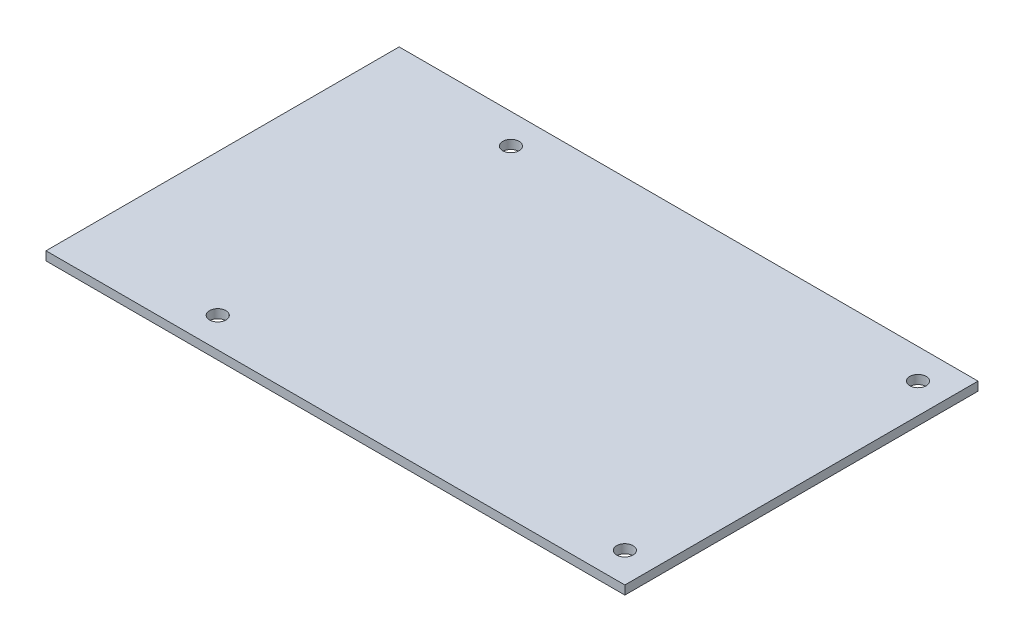
ISO-10303-21;
HEADER;
FILE_DESCRIPTION(('STEP AP214'),'2;1');
FILE_NAME('part.step','',(''),(''),'','','');
FILE_SCHEMA(('AUTOMOTIVE_DESIGN { 1 0 10303 214 1 1 1 1 }'));
ENDSEC;
DATA;
#1=APPLICATION_CONTEXT('core data for automotive mechanical design processes');
#2=APPLICATION_PROTOCOL_DEFINITION('international standard','automotive_design',2000,#1);
#3=PRODUCT_CONTEXT('',#1,'mechanical');
#4=PRODUCT('Part','Part','',(#3));
#5=PRODUCT_RELATED_PRODUCT_CATEGORY('part','',(#4));
#6=PRODUCT_DEFINITION_FORMATION('','',#4);
#7=PRODUCT_DEFINITION_CONTEXT('part definition',#1,'design');
#8=PRODUCT_DEFINITION('design','',#6,#7);
#9=PRODUCT_DEFINITION_SHAPE('','',#8);
#10=(LENGTH_UNIT() NAMED_UNIT(*) SI_UNIT(.MILLI.,.METRE.));
#11=(NAMED_UNIT(*) PLANE_ANGLE_UNIT() SI_UNIT($,.RADIAN.));
#12=(NAMED_UNIT(*) SI_UNIT($,.STERADIAN.) SOLID_ANGLE_UNIT());
#13=UNCERTAINTY_MEASURE_WITH_UNIT(LENGTH_MEASURE(1.E-05),#10,'distance_accuracy_value','');
#14=(GEOMETRIC_REPRESENTATION_CONTEXT(3) GLOBAL_UNCERTAINTY_ASSIGNED_CONTEXT((#13)) GLOBAL_UNIT_ASSIGNED_CONTEXT((#10,
#11,#12)) REPRESENTATION_CONTEXT('',''));
#15=CARTESIAN_POINT('',(0.,0.,0.));
#16=DIRECTION('',(0.,0.,1.));
#17=DIRECTION('',(1.,0.,0.));
#18=AXIS2_PLACEMENT_3D('',#15,#16,#17);
#19=CARTESIAN_POINT('',(53.086,1.6129,32.385));
#20=DIRECTION('',(-1.,0.,0.));
#21=DIRECTION('',(0.,0.,1.));
#22=AXIS2_PLACEMENT_3D('',#19,#20,#21);
#23=PLANE('',#22);
#24=DIRECTION('',(0.,0.,-1.));
#25=VECTOR('',#24,1.);
#26=CARTESIAN_POINT('',(53.086,0.,32.385));
#27=LINE('',#26,#25);
#28=CARTESIAN_POINT('',(53.086,0.,32.385));
#29=VERTEX_POINT('',#28);
#30=CARTESIAN_POINT('',(53.086,0.,-32.385));
#31=VERTEX_POINT('',#30);
#32=EDGE_CURVE('E113',#29,#31,#27,.T.);
#33=ORIENTED_EDGE('',*,*,#32,.T.);
#34=DIRECTION('',(0.,-1.,0.));
#35=VECTOR('',#34,1.);
#36=CARTESIAN_POINT('',(53.086,1.6129,-32.385));
#37=LINE('',#36,#35);
#38=CARTESIAN_POINT('',(53.086,1.6129,-32.385));
#39=VERTEX_POINT('',#38);
#40=EDGE_CURVE('E11',#39,#31,#37,.T.);
#41=ORIENTED_EDGE('',*,*,#40,.F.);
#42=DIRECTION('',(0.,0.,-1.));
#43=VECTOR('',#42,1.);
#44=CARTESIAN_POINT('',(53.086,1.6129,32.385));
#45=LINE('',#44,#43);
#46=CARTESIAN_POINT('',(53.086,1.6129,32.385));
#47=VERTEX_POINT('',#46);
#48=EDGE_CURVE('E97',#47,#39,#45,.T.);
#49=ORIENTED_EDGE('',*,*,#48,.F.);
#50=DIRECTION('',(0.,-1.,0.));
#51=VECTOR('',#50,1.);
#52=CARTESIAN_POINT('',(53.086,1.6129,32.385));
#53=LINE('',#52,#51);
#54=EDGE_CURVE('E109',#47,#29,#53,.T.);
#55=ORIENTED_EDGE('',*,*,#54,.T.);
#56=EDGE_LOOP('',(#33,#41,#49,#55));
#57=FACE_BOUND('',#56,.T.);
#58=ADVANCED_FACE('F45',(#57),#23,.F.);
#59=CARTESIAN_POINT('',(-53.086,1.6129,-32.385));
#60=DIRECTION('',(0.,0.,1.));
#61=DIRECTION('',(1.,0.,0.));
#62=AXIS2_PLACEMENT_3D('',#59,#60,#61);
#63=PLANE('',#62);
#64=DIRECTION('',(-1.,0.,0.));
#65=VECTOR('',#64,1.);
#66=CARTESIAN_POINT('',(-53.086,0.,-32.385));
#67=LINE('',#66,#65);
#68=CARTESIAN_POINT('',(-53.086,0.,-32.385));
#69=VERTEX_POINT('',#68);
#70=EDGE_CURVE('E102',#31,#69,#67,.T.);
#71=ORIENTED_EDGE('',*,*,#70,.T.);
#72=DIRECTION('',(0.,-1.,0.));
#73=VECTOR('',#72,1.);
#74=CARTESIAN_POINT('',(-53.086,1.6129,-32.385));
#75=LINE('',#74,#73);
#76=CARTESIAN_POINT('',(-53.086,1.6129,-32.385));
#77=VERTEX_POINT('',#76);
#78=EDGE_CURVE('E54',#77,#69,#75,.T.);
#79=ORIENTED_EDGE('',*,*,#78,.F.);
#80=DIRECTION('',(-1.,0.,0.));
#81=VECTOR('',#80,1.);
#82=CARTESIAN_POINT('',(-53.086,1.6129,-32.385));
#83=LINE('',#82,#81);
#84=EDGE_CURVE('E92',#39,#77,#83,.T.);
#85=ORIENTED_EDGE('',*,*,#84,.F.);
#86=ORIENTED_EDGE('',*,*,#40,.T.);
#87=EDGE_LOOP('',(#71,#79,#85,#86));
#88=FACE_BOUND('',#87,.T.);
#89=ADVANCED_FACE('F101',(#88),#63,.F.);
#90=CARTESIAN_POINT('',(-53.086,1.6129,32.385));
#91=DIRECTION('',(1.,0.,0.));
#92=DIRECTION('',(0.,0.,-1.));
#93=AXIS2_PLACEMENT_3D('',#90,#91,#92);
#94=PLANE('',#93);
#95=DIRECTION('',(0.,0.,1.));
#96=VECTOR('',#95,1.);
#97=CARTESIAN_POINT('',(-53.086,0.,32.385));
#98=LINE('',#97,#96);
#99=CARTESIAN_POINT('',(-53.086,0.,32.385));
#100=VERTEX_POINT('',#99);
#101=EDGE_CURVE('E79',#69,#100,#98,.T.);
#102=ORIENTED_EDGE('',*,*,#101,.T.);
#103=DIRECTION('',(0.,-1.,0.));
#104=VECTOR('',#103,1.);
#105=CARTESIAN_POINT('',(-53.086,1.6129,32.385));
#106=LINE('',#105,#104);
#107=CARTESIAN_POINT('',(-53.086,1.6129,32.385));
#108=VERTEX_POINT('',#107);
#109=EDGE_CURVE('E104',#108,#100,#106,.T.);
#110=ORIENTED_EDGE('',*,*,#109,.F.);
#111=DIRECTION('',(0.,0.,1.));
#112=VECTOR('',#111,1.);
#113=CARTESIAN_POINT('',(-53.086,1.6129,32.385));
#114=LINE('',#113,#112);
#115=EDGE_CURVE('E95',#77,#108,#114,.T.);
#116=ORIENTED_EDGE('',*,*,#115,.F.);
#117=ORIENTED_EDGE('',*,*,#78,.T.);
#118=EDGE_LOOP('',(#102,#110,#116,#117));
#119=FACE_BOUND('',#118,.T.);
#120=ADVANCED_FACE('F105',(#119),#94,.F.);
#121=CARTESIAN_POINT('',(-53.086,1.6129,32.385));
#122=DIRECTION('',(0.,0.,-1.));
#123=DIRECTION('',(-1.,0.,0.));
#124=AXIS2_PLACEMENT_3D('',#121,#122,#123);
#125=PLANE('',#124);
#126=DIRECTION('',(1.,0.,0.));
#127=VECTOR('',#126,1.);
#128=CARTESIAN_POINT('',(-53.086,0.,32.385));
#129=LINE('',#128,#127);
#130=EDGE_CURVE('E85',#100,#29,#129,.T.);
#131=ORIENTED_EDGE('',*,*,#130,.T.);
#132=ORIENTED_EDGE('',*,*,#54,.F.);
#133=DIRECTION('',(1.,0.,0.));
#134=VECTOR('',#133,1.);
#135=CARTESIAN_POINT('',(-53.086,1.6129,32.385));
#136=LINE('',#135,#134);
#137=EDGE_CURVE('E62',#108,#47,#136,.T.);
#138=ORIENTED_EDGE('',*,*,#137,.F.);
#139=ORIENTED_EDGE('',*,*,#109,.T.);
#140=EDGE_LOOP('',(#131,#132,#138,#139));
#141=FACE_BOUND('',#140,.T.);
#142=ADVANCED_FACE('F127',(#141),#125,.F.);
#143=CARTESIAN_POINT('',(0.,1.6129,0.));
#144=DIRECTION('',(0.,-1.,0.));
#145=DIRECTION('',(0.,0.,-1.));
#146=AXIS2_PLACEMENT_3D('',#143,#144,#145);
#147=PLANE('',#146);
#148=CARTESIAN_POINT('',(-27.086,1.6129,-26.885));
#149=DIRECTION('',(0.,1.,0.));
#150=DIRECTION('',(0.,0.,1.));
#151=AXIS2_PLACEMENT_3D('',#148,#149,#150);
#152=CIRCLE('',#151,1.5);
#153=CARTESIAN_POINT('',(-27.086,1.6129,-25.385));
#154=VERTEX_POINT('',#153);
#155=EDGE_CURVE('E146',#154,#154,#152,.T.);
#156=ORIENTED_EDGE('',*,*,#155,.F.);
#157=EDGE_LOOP('',(#156));
#158=FACE_BOUND('',#157,.T.);
#159=CARTESIAN_POINT('',(-27.086,1.6129,26.885));
#160=DIRECTION('',(0.,1.,0.));
#161=DIRECTION('',(0.,0.,1.));
#162=AXIS2_PLACEMENT_3D('',#159,#160,#161);
#163=CIRCLE('',#162,1.5);
#164=CARTESIAN_POINT('',(-27.086,1.6129,28.385));
#165=VERTEX_POINT('',#164);
#166=EDGE_CURVE('E154',#165,#165,#163,.T.);
#167=ORIENTED_EDGE('',*,*,#166,.F.);
#168=EDGE_LOOP('',(#167));
#169=FACE_BOUND('',#168,.T.);
#170=CARTESIAN_POINT('',(47.586,1.6129,26.885));
#171=DIRECTION('',(0.,1.,0.));
#172=DIRECTION('',(0.,0.,1.));
#173=AXIS2_PLACEMENT_3D('',#170,#171,#172);
#174=CIRCLE('',#173,1.5);
#175=CARTESIAN_POINT('',(47.586,1.6129,28.385));
#176=VERTEX_POINT('',#175);
#177=EDGE_CURVE('E138',#176,#176,#174,.T.);
#178=ORIENTED_EDGE('',*,*,#177,.F.);
#179=EDGE_LOOP('',(#178));
#180=FACE_BOUND('',#179,.T.);
#181=CARTESIAN_POINT('',(47.586,1.6129,-26.885));
#182=DIRECTION('',(0.,1.,0.));
#183=DIRECTION('',(0.,0.,1.));
#184=AXIS2_PLACEMENT_3D('',#181,#182,#183);
#185=CIRCLE('',#184,1.5);
#186=CARTESIAN_POINT('',(47.586,1.6129,-25.385));
#187=VERTEX_POINT('',#186);
#188=EDGE_CURVE('E134',#187,#187,#185,.T.);
#189=ORIENTED_EDGE('',*,*,#188,.F.);
#190=EDGE_LOOP('',(#189));
#191=FACE_BOUND('',#190,.T.);
#192=ORIENTED_EDGE('',*,*,#48,.T.);
#193=ORIENTED_EDGE('',*,*,#84,.T.);
#194=ORIENTED_EDGE('',*,*,#115,.T.);
#195=ORIENTED_EDGE('',*,*,#137,.T.);
#196=EDGE_LOOP('',(#192,#193,#194,#195));
#197=FACE_BOUND('',#196,.T.);
#198=ADVANCED_FACE('F93',(#158,#169,#180,#191,#197),#147,.F.);
#199=CARTESIAN_POINT('',(0.,0.,0.));
#200=DIRECTION('',(0.,-1.,0.));
#201=DIRECTION('',(0.,0.,-1.));
#202=AXIS2_PLACEMENT_3D('',#199,#200,#201);
#203=PLANE('',#202);
#204=CARTESIAN_POINT('',(-27.086,0.,-26.885));
#205=DIRECTION('',(0.,1.,0.));
#206=DIRECTION('',(0.,0.,1.));
#207=AXIS2_PLACEMENT_3D('',#204,#205,#206);
#208=CIRCLE('',#207,1.5);
#209=CARTESIAN_POINT('',(-27.086,0.,-25.385));
#210=VERTEX_POINT('',#209);
#211=EDGE_CURVE('E142',#210,#210,#208,.T.);
#212=ORIENTED_EDGE('',*,*,#211,.T.);
#213=EDGE_LOOP('',(#212));
#214=FACE_BOUND('',#213,.T.);
#215=CARTESIAN_POINT('',(-27.086,0.,26.885));
#216=DIRECTION('',(0.,1.,0.));
#217=DIRECTION('',(0.,0.,1.));
#218=AXIS2_PLACEMENT_3D('',#215,#216,#217);
#219=CIRCLE('',#218,1.5);
#220=CARTESIAN_POINT('',(-27.086,0.,28.385));
#221=VERTEX_POINT('',#220);
#222=EDGE_CURVE('E150',#221,#221,#219,.T.);
#223=ORIENTED_EDGE('',*,*,#222,.T.);
#224=EDGE_LOOP('',(#223));
#225=FACE_BOUND('',#224,.T.);
#226=CARTESIAN_POINT('',(47.586,0.,26.885));
#227=DIRECTION('',(0.,1.,0.));
#228=DIRECTION('',(0.,0.,1.));
#229=AXIS2_PLACEMENT_3D('',#226,#227,#228);
#230=CIRCLE('',#229,1.5);
#231=CARTESIAN_POINT('',(47.586,0.,28.385));
#232=VERTEX_POINT('',#231);
#233=EDGE_CURVE('E158',#232,#232,#230,.T.);
#234=ORIENTED_EDGE('',*,*,#233,.T.);
#235=EDGE_LOOP('',(#234));
#236=FACE_BOUND('',#235,.T.);
#237=CARTESIAN_POINT('',(47.586,0.,-26.885));
#238=DIRECTION('',(0.,1.,0.));
#239=DIRECTION('',(0.,0.,1.));
#240=AXIS2_PLACEMENT_3D('',#237,#238,#239);
#241=CIRCLE('',#240,1.5);
#242=CARTESIAN_POINT('',(47.586,0.,-25.385));
#243=VERTEX_POINT('',#242);
#244=EDGE_CURVE('E117',#243,#243,#241,.T.);
#245=ORIENTED_EDGE('',*,*,#244,.T.);
#246=EDGE_LOOP('',(#245));
#247=FACE_BOUND('',#246,.T.);
#248=ORIENTED_EDGE('',*,*,#32,.F.);
#249=ORIENTED_EDGE('',*,*,#130,.F.);
#250=ORIENTED_EDGE('',*,*,#101,.F.);
#251=ORIENTED_EDGE('',*,*,#70,.F.);
#252=EDGE_LOOP('',(#248,#249,#250,#251));
#253=FACE_BOUND('',#252,.T.);
#254=ADVANCED_FACE('F130',(#214,#225,#236,#247,#253),#203,.T.);
#255=CARTESIAN_POINT('',(47.586,0.,-26.885));
#256=DIRECTION('',(0.,1.,0.));
#257=DIRECTION('',(0.,0.,1.));
#258=AXIS2_PLACEMENT_3D('',#255,#256,#257);
#259=CYLINDRICAL_SURFACE('',#258,1.5);
#260=ORIENTED_EDGE('',*,*,#244,.F.);
#261=EDGE_LOOP('',(#260));
#262=FACE_BOUND('',#261,.T.);
#263=ORIENTED_EDGE('',*,*,#188,.T.);
#264=EDGE_LOOP('',(#263));
#265=FACE_BOUND('',#264,.T.);
#266=ADVANCED_FACE('F174',(#262,#265),#259,.F.);
#267=CARTESIAN_POINT('',(47.586,0.,26.885));
#268=DIRECTION('',(0.,1.,0.));
#269=DIRECTION('',(0.,0.,1.));
#270=AXIS2_PLACEMENT_3D('',#267,#268,#269);
#271=CYLINDRICAL_SURFACE('',#270,1.5);
#272=ORIENTED_EDGE('',*,*,#233,.F.);
#273=EDGE_LOOP('',(#272));
#274=FACE_BOUND('',#273,.T.);
#275=ORIENTED_EDGE('',*,*,#177,.T.);
#276=EDGE_LOOP('',(#275));
#277=FACE_BOUND('',#276,.T.);
#278=ADVANCED_FACE('F166',(#274,#277),#271,.F.);
#279=CARTESIAN_POINT('',(-27.086,0.,26.885));
#280=DIRECTION('',(0.,1.,0.));
#281=DIRECTION('',(0.,0.,1.));
#282=AXIS2_PLACEMENT_3D('',#279,#280,#281);
#283=CYLINDRICAL_SURFACE('',#282,1.5);
#284=ORIENTED_EDGE('',*,*,#222,.F.);
#285=EDGE_LOOP('',(#284));
#286=FACE_BOUND('',#285,.T.);
#287=ORIENTED_EDGE('',*,*,#166,.T.);
#288=EDGE_LOOP('',(#287));
#289=FACE_BOUND('',#288,.T.);
#290=ADVANCED_FACE('F182',(#286,#289),#283,.F.);
#291=CARTESIAN_POINT('',(-27.086,0.,-26.885));
#292=DIRECTION('',(0.,1.,0.));
#293=DIRECTION('',(0.,0.,1.));
#294=AXIS2_PLACEMENT_3D('',#291,#292,#293);
#295=CYLINDRICAL_SURFACE('',#294,1.5);
#296=ORIENTED_EDGE('',*,*,#211,.F.);
#297=EDGE_LOOP('',(#296));
#298=FACE_BOUND('',#297,.T.);
#299=ORIENTED_EDGE('',*,*,#155,.T.);
#300=EDGE_LOOP('',(#299));
#301=FACE_BOUND('',#300,.T.);
#302=ADVANCED_FACE('F233',(#298,#301),#295,.F.);
#303=CLOSED_SHELL('',(#58,#89,#120,#142,#198,#254,#266,#278,#290,#302));
#304=MANIFOLD_SOLID_BREP('B2',#303);
#305=ADVANCED_BREP_SHAPE_REPRESENTATION('',(#18,#304),#14);
#306=SHAPE_DEFINITION_REPRESENTATION(#9,#305);
ENDSEC;
END-ISO-10303-21;
